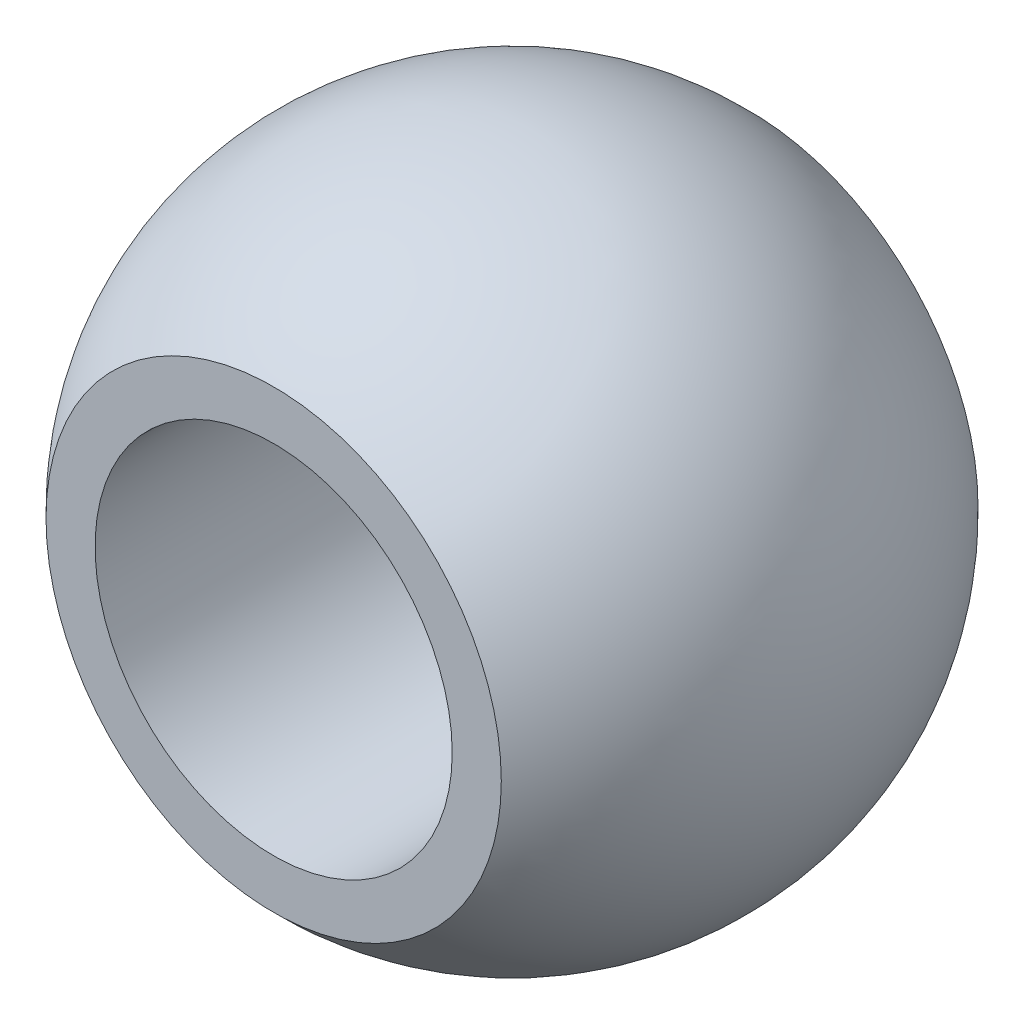
ISO-10303-21;
HEADER;
FILE_DESCRIPTION(('STEP AP214'),'2;1');
FILE_NAME('part.step','',(''),(''),'','','');
FILE_SCHEMA(('AUTOMOTIVE_DESIGN { 1 0 10303 214 1 1 1 1 }'));
ENDSEC;
DATA;
#1=APPLICATION_CONTEXT('core data for automotive mechanical design processes');
#2=APPLICATION_PROTOCOL_DEFINITION('international standard','automotive_design',2000,#1);
#3=PRODUCT_CONTEXT('',#1,'mechanical');
#4=PRODUCT('Part','Part','',(#3));
#5=PRODUCT_RELATED_PRODUCT_CATEGORY('part','',(#4));
#6=PRODUCT_DEFINITION_FORMATION('','',#4);
#7=PRODUCT_DEFINITION_CONTEXT('part definition',#1,'design');
#8=PRODUCT_DEFINITION('design','',#6,#7);
#9=PRODUCT_DEFINITION_SHAPE('','',#8);
#10=(LENGTH_UNIT() NAMED_UNIT(*) SI_UNIT(.MILLI.,.METRE.));
#11=(NAMED_UNIT(*) PLANE_ANGLE_UNIT() SI_UNIT($,.RADIAN.));
#12=(NAMED_UNIT(*) SI_UNIT($,.STERADIAN.) SOLID_ANGLE_UNIT());
#13=UNCERTAINTY_MEASURE_WITH_UNIT(LENGTH_MEASURE(1.E-05),#10,'distance_accuracy_value','');
#14=(GEOMETRIC_REPRESENTATION_CONTEXT(3) GLOBAL_UNCERTAINTY_ASSIGNED_CONTEXT((#13)) GLOBAL_UNIT_ASSIGNED_CONTEXT((#10,
#11,#12)) REPRESENTATION_CONTEXT('',''));
#15=CARTESIAN_POINT('',(0.,0.,0.));
#16=DIRECTION('',(0.,0.,1.));
#17=DIRECTION('',(1.,0.,0.));
#18=AXIS2_PLACEMENT_3D('',#15,#16,#17);
#19=CARTESIAN_POINT('',(0.,0.,0.));
#20=DIRECTION('',(0.,1.,0.));
#21=DIRECTION('',(1.,0.,0.));
#22=AXIS2_PLACEMENT_3D('',#19,#20,#21);
#23=SPHERICAL_SURFACE('',#22,11.075);
#24=CARTESIAN_POINT('',(0.,0.,0.));
#25=DIRECTION('',(0.,0.,1.));
#26=DIRECTION('',(1.,0.,0.));
#27=AXIS2_PLACEMENT_3D('',#24,#25,#26);
#28=SPHERICAL_SURFACE('',#27,11.075);
#29=CARTESIAN_POINT('',(0.,0.,-8.0089003109927));
#30=DIRECTION('',(0.,0.,1.));
#31=DIRECTION('',(1.,0.,0.));
#32=AXIS2_PLACEMENT_3D('',#29,#30,#31);
#33=CIRCLE('',#32,7.64938826368364);
#34=CARTESIAN_POINT('',(7.64938826368364,0.,-8.0089003109927));
#35=VERTEX_POINT('',#34);
#36=EDGE_CURVE('E43',#35,#35,#33,.T.);
#37=ORIENTED_EDGE('',*,*,#36,.T.);
#38=EDGE_LOOP('',(#37));
#39=FACE_BOUND('',#38,.T.);
#40=CARTESIAN_POINT('',(0.,0.,8.0089003109927));
#41=DIRECTION('',(0.,0.,1.));
#42=DIRECTION('',(1.,0.,0.));
#43=AXIS2_PLACEMENT_3D('',#40,#41,#42);
#44=CIRCLE('',#43,7.64938826368364);
#45=CARTESIAN_POINT('',(7.64938826368364,0.,8.0089003109927));
#46=VERTEX_POINT('',#45);
#47=EDGE_CURVE('E10',#46,#46,#44,.T.);
#48=ORIENTED_EDGE('',*,*,#47,.F.);
#49=EDGE_LOOP('',(#48));
#50=FACE_BOUND('',#49,.T.);
#51=ADVANCED_FACE('F31',(#39,#50),#28,.T.);
#52=CARTESIAN_POINT('',(0.,0.,-75.));
#53=DIRECTION('',(0.,0.,1.));
#54=DIRECTION('',(1.,0.,0.));
#55=AXIS2_PLACEMENT_3D('',#52,#53,#54);
#56=CYLINDRICAL_SURFACE('',#55,6.);
#57=CARTESIAN_POINT('',(0.,0.,-8.0089003109927));
#58=DIRECTION('',(0.,0.,1.));
#59=DIRECTION('',(1.,0.,0.));
#60=AXIS2_PLACEMENT_3D('',#57,#58,#59);
#61=CIRCLE('',#60,6.);
#62=CARTESIAN_POINT('',(6.,0.,-8.0089003109927));
#63=VERTEX_POINT('',#62);
#64=EDGE_CURVE('E34',#63,#63,#61,.F.);
#65=ORIENTED_EDGE('',*,*,#64,.T.);
#66=EDGE_LOOP('',(#65));
#67=FACE_BOUND('',#66,.T.);
#68=CARTESIAN_POINT('',(0.,0.,8.0089003109927));
#69=DIRECTION('',(0.,0.,1.));
#70=DIRECTION('',(1.,0.,0.));
#71=AXIS2_PLACEMENT_3D('',#68,#69,#70);
#72=CIRCLE('',#71,6.);
#73=CARTESIAN_POINT('',(6.,0.,8.0089003109927));
#74=VERTEX_POINT('',#73);
#75=EDGE_CURVE('E38',#74,#74,#72,.F.);
#76=ORIENTED_EDGE('',*,*,#75,.F.);
#77=EDGE_LOOP('',(#76));
#78=FACE_BOUND('',#77,.T.);
#79=ADVANCED_FACE('F51',(#67,#78),#56,.F.);
#80=CARTESIAN_POINT('',(0.,0.,8.0089003109927));
#81=DIRECTION('',(0.,0.,1.));
#82=DIRECTION('',(1.,0.,0.));
#83=AXIS2_PLACEMENT_3D('',#80,#81,#82);
#84=PLANE('',#83);
#85=ORIENTED_EDGE('',*,*,#75,.T.);
#86=EDGE_LOOP('',(#85));
#87=FACE_BOUND('',#86,.T.);
#88=ORIENTED_EDGE('',*,*,#47,.T.);
#89=EDGE_LOOP('',(#88));
#90=FACE_BOUND('',#89,.T.);
#91=ADVANCED_FACE('F57',(#87,#90),#84,.T.);
#92=CARTESIAN_POINT('',(0.,0.,-8.0089003109927));
#93=DIRECTION('',(0.,0.,1.));
#94=DIRECTION('',(1.,0.,0.));
#95=AXIS2_PLACEMENT_3D('',#92,#93,#94);
#96=PLANE('',#95);
#97=ORIENTED_EDGE('',*,*,#64,.F.);
#98=EDGE_LOOP('',(#97));
#99=FACE_BOUND('',#98,.T.);
#100=ORIENTED_EDGE('',*,*,#36,.F.);
#101=EDGE_LOOP('',(#100));
#102=FACE_BOUND('',#101,.T.);
#103=ADVANCED_FACE('F54',(#99,#102),#96,.F.);
#104=CLOSED_SHELL('',(#51,#79,#91,#103));
#105=MANIFOLD_SOLID_BREP('B2',#104);
#106=ADVANCED_BREP_SHAPE_REPRESENTATION('',(#18,#105),#14);
#107=SHAPE_DEFINITION_REPRESENTATION(#9,#106);
ENDSEC;
END-ISO-10303-21;
